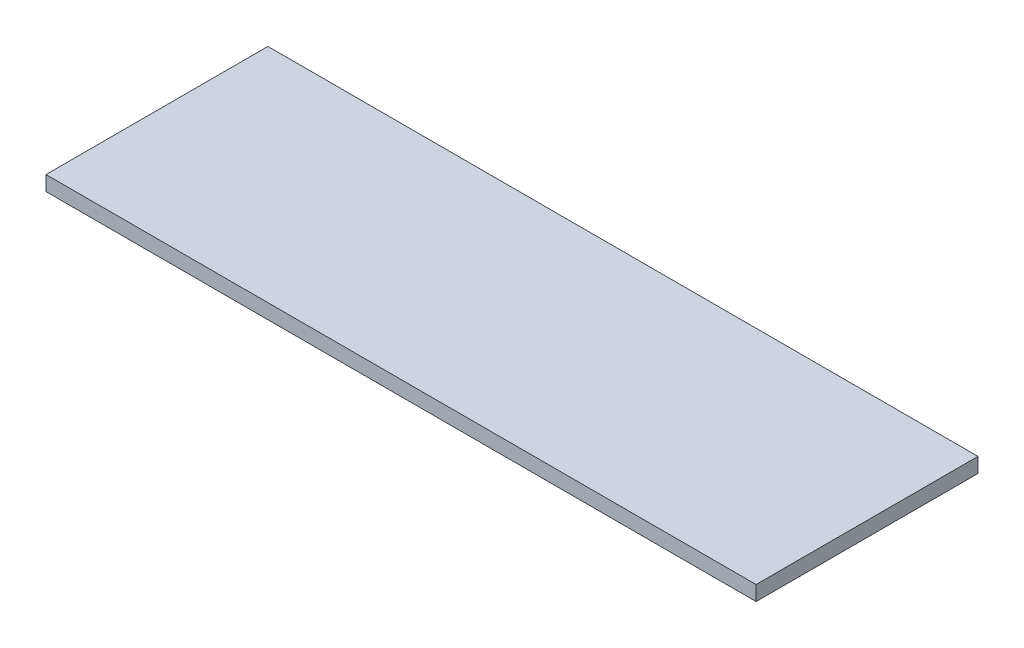
ISO-10303-21;
HEADER;
FILE_DESCRIPTION(('STEP AP214'),'2;1');
FILE_NAME('part.step','',(''),(''),'','','');
FILE_SCHEMA(('AUTOMOTIVE_DESIGN { 1 0 10303 214 1 1 1 1 }'));
ENDSEC;
DATA;
#1=APPLICATION_CONTEXT('core data for automotive mechanical design processes');
#2=APPLICATION_PROTOCOL_DEFINITION('international standard','automotive_design',2000,#1);
#3=PRODUCT_CONTEXT('',#1,'mechanical');
#4=PRODUCT('Part','Part','',(#3));
#5=PRODUCT_RELATED_PRODUCT_CATEGORY('part','',(#4));
#6=PRODUCT_DEFINITION_FORMATION('','',#4);
#7=PRODUCT_DEFINITION_CONTEXT('part definition',#1,'design');
#8=PRODUCT_DEFINITION('design','',#6,#7);
#9=PRODUCT_DEFINITION_SHAPE('','',#8);
#10=(LENGTH_UNIT() NAMED_UNIT(*) SI_UNIT(.MILLI.,.METRE.));
#11=(NAMED_UNIT(*) PLANE_ANGLE_UNIT() SI_UNIT($,.RADIAN.));
#12=(NAMED_UNIT(*) SI_UNIT($,.STERADIAN.) SOLID_ANGLE_UNIT());
#13=UNCERTAINTY_MEASURE_WITH_UNIT(LENGTH_MEASURE(1.E-05),#10,'distance_accuracy_value','');
#14=(GEOMETRIC_REPRESENTATION_CONTEXT(3) GLOBAL_UNCERTAINTY_ASSIGNED_CONTEXT((#13)) GLOBAL_UNIT_ASSIGNED_CONTEXT((#10,
#11,#12)) REPRESENTATION_CONTEXT('',''));
#15=CARTESIAN_POINT('',(0.,0.,0.));
#16=DIRECTION('',(0.,0.,1.));
#17=DIRECTION('',(1.,0.,0.));
#18=AXIS2_PLACEMENT_3D('',#15,#16,#17);
#19=CARTESIAN_POINT('',(0.,6.,-90.));
#20=DIRECTION('',(1.,0.,0.));
#21=DIRECTION('',(0.,0.,-1.));
#22=AXIS2_PLACEMENT_3D('',#19,#20,#21);
#23=PLANE('',#22);
#24=DIRECTION('',(0.,0.,1.));
#25=VECTOR('',#24,1.);
#26=CARTESIAN_POINT('',(0.,0.,-90.));
#27=LINE('',#26,#25);
#28=CARTESIAN_POINT('',(0.,0.,-90.));
#29=VERTEX_POINT('',#28);
#30=CARTESIAN_POINT('',(0.,0.,0.));
#31=VERTEX_POINT('',#30);
#32=EDGE_CURVE('E97',#29,#31,#27,.T.);
#33=ORIENTED_EDGE('',*,*,#32,.T.);
#34=DIRECTION('',(0.,-1.,0.));
#35=VECTOR('',#34,1.);
#36=CARTESIAN_POINT('',(0.,6.,0.));
#37=LINE('',#36,#35);
#38=CARTESIAN_POINT('',(0.,6.,0.));
#39=VERTEX_POINT('',#38);
#40=EDGE_CURVE('E11',#39,#31,#37,.T.);
#41=ORIENTED_EDGE('',*,*,#40,.F.);
#42=DIRECTION('',(0.,0.,1.));
#43=VECTOR('',#42,1.);
#44=CARTESIAN_POINT('',(0.,6.,-90.));
#45=LINE('',#44,#43);
#46=CARTESIAN_POINT('',(0.,6.,-90.));
#47=VERTEX_POINT('',#46);
#48=EDGE_CURVE('E85',#47,#39,#45,.T.);
#49=ORIENTED_EDGE('',*,*,#48,.F.);
#50=DIRECTION('',(0.,-1.,0.));
#51=VECTOR('',#50,1.);
#52=CARTESIAN_POINT('',(0.,6.,-90.));
#53=LINE('',#52,#51);
#54=EDGE_CURVE('E93',#47,#29,#53,.T.);
#55=ORIENTED_EDGE('',*,*,#54,.T.);
#56=EDGE_LOOP('',(#33,#41,#49,#55));
#57=FACE_BOUND('',#56,.T.);
#58=ADVANCED_FACE('F34',(#57),#23,.F.);
#59=CARTESIAN_POINT('',(0.,6.,0.));
#60=DIRECTION('',(0.,0.,-1.));
#61=DIRECTION('',(-1.,0.,0.));
#62=AXIS2_PLACEMENT_3D('',#59,#60,#61);
#63=PLANE('',#62);
#64=DIRECTION('',(1.,0.,0.));
#65=VECTOR('',#64,1.);
#66=CARTESIAN_POINT('',(0.,0.,0.));
#67=LINE('',#66,#65);
#68=CARTESIAN_POINT('',(288.,0.,0.));
#69=VERTEX_POINT('',#68);
#70=EDGE_CURVE('E89',#31,#69,#67,.T.);
#71=ORIENTED_EDGE('',*,*,#70,.T.);
#72=DIRECTION('',(0.,-1.,0.));
#73=VECTOR('',#72,1.);
#74=CARTESIAN_POINT('',(288.,6.,0.));
#75=LINE('',#74,#73);
#76=CARTESIAN_POINT('',(288.,6.,0.));
#77=VERTEX_POINT('',#76);
#78=EDGE_CURVE('E42',#77,#69,#75,.T.);
#79=ORIENTED_EDGE('',*,*,#78,.F.);
#80=DIRECTION('',(1.,0.,0.));
#81=VECTOR('',#80,1.);
#82=CARTESIAN_POINT('',(0.,6.,0.));
#83=LINE('',#82,#81);
#84=EDGE_CURVE('E80',#39,#77,#83,.T.);
#85=ORIENTED_EDGE('',*,*,#84,.F.);
#86=ORIENTED_EDGE('',*,*,#40,.T.);
#87=EDGE_LOOP('',(#71,#79,#85,#86));
#88=FACE_BOUND('',#87,.T.);
#89=ADVANCED_FACE('F88',(#88),#63,.F.);
#90=CARTESIAN_POINT('',(288.,6.,0.));
#91=DIRECTION('',(-1.,0.,0.));
#92=DIRECTION('',(0.,0.,1.));
#93=AXIS2_PLACEMENT_3D('',#90,#91,#92);
#94=PLANE('',#93);
#95=DIRECTION('',(0.,0.,-1.));
#96=VECTOR('',#95,1.);
#97=CARTESIAN_POINT('',(288.,0.,0.));
#98=LINE('',#97,#96);
#99=CARTESIAN_POINT('',(288.,0.,-90.));
#100=VERTEX_POINT('',#99);
#101=EDGE_CURVE('E67',#69,#100,#98,.T.);
#102=ORIENTED_EDGE('',*,*,#101,.T.);
#103=DIRECTION('',(0.,-1.,0.));
#104=VECTOR('',#103,1.);
#105=CARTESIAN_POINT('',(288.,6.,-90.));
#106=LINE('',#105,#104);
#107=CARTESIAN_POINT('',(288.,6.,-90.));
#108=VERTEX_POINT('',#107);
#109=EDGE_CURVE('E90',#108,#100,#106,.T.);
#110=ORIENTED_EDGE('',*,*,#109,.F.);
#111=DIRECTION('',(0.,0.,-1.));
#112=VECTOR('',#111,1.);
#113=CARTESIAN_POINT('',(288.,6.,0.));
#114=LINE('',#113,#112);
#115=EDGE_CURVE('E83',#77,#108,#114,.T.);
#116=ORIENTED_EDGE('',*,*,#115,.F.);
#117=ORIENTED_EDGE('',*,*,#78,.T.);
#118=EDGE_LOOP('',(#102,#110,#116,#117));
#119=FACE_BOUND('',#118,.T.);
#120=ADVANCED_FACE('F91',(#119),#94,.F.);
#121=CARTESIAN_POINT('',(288.,6.,-90.));
#122=DIRECTION('',(0.,0.,1.));
#123=DIRECTION('',(1.,0.,0.));
#124=AXIS2_PLACEMENT_3D('',#121,#122,#123);
#125=PLANE('',#124);
#126=DIRECTION('',(-1.,0.,0.));
#127=VECTOR('',#126,1.);
#128=CARTESIAN_POINT('',(288.,0.,-90.));
#129=LINE('',#128,#127);
#130=EDGE_CURVE('E73',#100,#29,#129,.T.);
#131=ORIENTED_EDGE('',*,*,#130,.T.);
#132=ORIENTED_EDGE('',*,*,#54,.F.);
#133=DIRECTION('',(-1.,0.,0.));
#134=VECTOR('',#133,1.);
#135=CARTESIAN_POINT('',(288.,6.,-90.));
#136=LINE('',#135,#134);
#137=EDGE_CURVE('E50',#108,#47,#136,.T.);
#138=ORIENTED_EDGE('',*,*,#137,.F.);
#139=ORIENTED_EDGE('',*,*,#109,.T.);
#140=EDGE_LOOP('',(#131,#132,#138,#139));
#141=FACE_BOUND('',#140,.T.);
#142=ADVANCED_FACE('F104',(#141),#125,.F.);
#143=CARTESIAN_POINT('',(0.,6.,0.));
#144=DIRECTION('',(0.,1.,0.));
#145=DIRECTION('',(0.,0.,1.));
#146=AXIS2_PLACEMENT_3D('',#143,#144,#145);
#147=PLANE('',#146);
#148=ORIENTED_EDGE('',*,*,#48,.T.);
#149=ORIENTED_EDGE('',*,*,#84,.T.);
#150=ORIENTED_EDGE('',*,*,#115,.T.);
#151=ORIENTED_EDGE('',*,*,#137,.T.);
#152=EDGE_LOOP('',(#148,#149,#150,#151));
#153=FACE_BOUND('',#152,.T.);
#154=ADVANCED_FACE('F81',(#153),#147,.T.);
#155=CARTESIAN_POINT('',(0.,0.,0.));
#156=DIRECTION('',(0.,1.,0.));
#157=DIRECTION('',(0.,0.,1.));
#158=AXIS2_PLACEMENT_3D('',#155,#156,#157);
#159=PLANE('',#158);
#160=ORIENTED_EDGE('',*,*,#32,.F.);
#161=ORIENTED_EDGE('',*,*,#130,.F.);
#162=ORIENTED_EDGE('',*,*,#101,.F.);
#163=ORIENTED_EDGE('',*,*,#70,.F.);
#164=EDGE_LOOP('',(#160,#161,#162,#163));
#165=FACE_BOUND('',#164,.T.);
#166=ADVANCED_FACE('F107',(#165),#159,.F.);
#167=CLOSED_SHELL('',(#58,#89,#120,#142,#154,#166));
#168=MANIFOLD_SOLID_BREP('B2',#167);
#169=ADVANCED_BREP_SHAPE_REPRESENTATION('',(#18,#168),#14);
#170=SHAPE_DEFINITION_REPRESENTATION(#9,#169);
ENDSEC;
END-ISO-10303-21;
